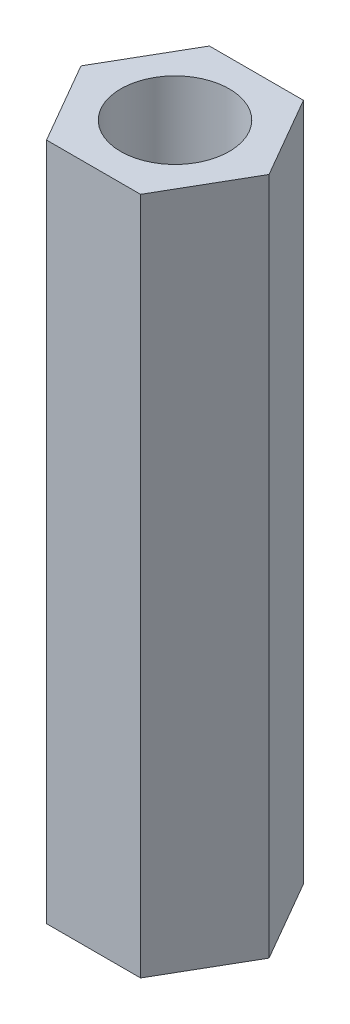
ISO-10303-21;
HEADER;
FILE_DESCRIPTION(('STEP AP214'),'2;1');
FILE_NAME('part.step','',(''),(''),'','','');
FILE_SCHEMA(('AUTOMOTIVE_DESIGN { 1 0 10303 214 1 1 1 1 }'));
ENDSEC;
DATA;
#1=APPLICATION_CONTEXT('core data for automotive mechanical design processes');
#2=APPLICATION_PROTOCOL_DEFINITION('international standard','automotive_design',2000,#1);
#3=PRODUCT_CONTEXT('',#1,'mechanical');
#4=PRODUCT('Part','Part','',(#3));
#5=PRODUCT_RELATED_PRODUCT_CATEGORY('part','',(#4));
#6=PRODUCT_DEFINITION_FORMATION('','',#4);
#7=PRODUCT_DEFINITION_CONTEXT('part definition',#1,'design');
#8=PRODUCT_DEFINITION('design','',#6,#7);
#9=PRODUCT_DEFINITION_SHAPE('','',#8);
#10=(LENGTH_UNIT() NAMED_UNIT(*) SI_UNIT(.MILLI.,.METRE.));
#11=(NAMED_UNIT(*) PLANE_ANGLE_UNIT() SI_UNIT($,.RADIAN.));
#12=(NAMED_UNIT(*) SI_UNIT($,.STERADIAN.) SOLID_ANGLE_UNIT());
#13=UNCERTAINTY_MEASURE_WITH_UNIT(LENGTH_MEASURE(1.E-05),#10,'distance_accuracy_value','');
#14=(GEOMETRIC_REPRESENTATION_CONTEXT(3) GLOBAL_UNCERTAINTY_ASSIGNED_CONTEXT((#13)) GLOBAL_UNIT_ASSIGNED_CONTEXT((#10,
#11,#12)) REPRESENTATION_CONTEXT('',''));
#15=CARTESIAN_POINT('',(0.,0.,0.));
#16=DIRECTION('',(0.,0.,1.));
#17=DIRECTION('',(1.,0.,0.));
#18=AXIS2_PLACEMENT_3D('',#15,#16,#17);
#19=CARTESIAN_POINT('',(0.,25.,0.));
#20=DIRECTION('',(0.,1.,0.));
#21=DIRECTION('',(0.,0.,1.));
#22=AXIS2_PLACEMENT_3D('',#19,#20,#21);
#23=PLANE('',#22);
#24=DIRECTION('',(-0.5,0.,0.866025403784439));
#25=VECTOR('',#24,1.);
#26=CARTESIAN_POINT('',(-1.73205080756888,25.,-3.));
#27=LINE('',#26,#25);
#28=CARTESIAN_POINT('',(-1.73205080756888,25.,-3.));
#29=VERTEX_POINT('',#28);
#30=CARTESIAN_POINT('',(-3.46410161513775,25.,0.));
#31=VERTEX_POINT('',#30);
#32=EDGE_CURVE('E150',#29,#31,#27,.T.);
#33=ORIENTED_EDGE('',*,*,#32,.T.);
#34=DIRECTION('',(0.499999999999999,0.,0.866025403784439));
#35=VECTOR('',#34,1.);
#36=CARTESIAN_POINT('',(-3.46410161513775,25.,0.));
#37=LINE('',#36,#35);
#38=CARTESIAN_POINT('',(-1.73205080756888,25.,3.));
#39=VERTEX_POINT('',#38);
#40=EDGE_CURVE('E98',#31,#39,#37,.T.);
#41=ORIENTED_EDGE('',*,*,#40,.T.);
#42=DIRECTION('',(1.,0.,0.));
#43=VECTOR('',#42,1.);
#44=CARTESIAN_POINT('',(-1.73205080756888,25.,3.));
#45=LINE('',#44,#43);
#46=CARTESIAN_POINT('',(1.73205080756888,25.,3.));
#47=VERTEX_POINT('',#46);
#48=EDGE_CURVE('E111',#39,#47,#45,.T.);
#49=ORIENTED_EDGE('',*,*,#48,.T.);
#50=DIRECTION('',(0.5,0.,-0.866025403784439));
#51=VECTOR('',#50,1.);
#52=CARTESIAN_POINT('',(1.73205080756888,25.,3.));
#53=LINE('',#52,#51);
#54=CARTESIAN_POINT('',(3.46410161513775,25.,0.));
#55=VERTEX_POINT('',#54);
#56=EDGE_CURVE('E105',#47,#55,#53,.T.);
#57=ORIENTED_EDGE('',*,*,#56,.T.);
#58=DIRECTION('',(-0.5,0.,-0.866025403784439));
#59=VECTOR('',#58,1.);
#60=CARTESIAN_POINT('',(3.46410161513775,25.,0.));
#61=LINE('',#60,#59);
#62=CARTESIAN_POINT('',(1.73205080756888,25.,-3.));
#63=VERTEX_POINT('',#62);
#64=EDGE_CURVE('E109',#55,#63,#61,.T.);
#65=ORIENTED_EDGE('',*,*,#64,.T.);
#66=DIRECTION('',(-1.,0.,0.));
#67=VECTOR('',#66,1.);
#68=CARTESIAN_POINT('',(1.73205080756888,25.,-3.));
#69=LINE('',#68,#67);
#70=EDGE_CURVE('E61',#63,#29,#69,.T.);
#71=ORIENTED_EDGE('',*,*,#70,.T.);
#72=EDGE_LOOP('',(#33,#41,#49,#57,#65,#71));
#73=FACE_BOUND('',#72,.T.);
#74=CARTESIAN_POINT('',(0.,25.,0.));
#75=DIRECTION('',(0.,1.,0.));
#76=DIRECTION('',(0.,0.,1.));
#77=AXIS2_PLACEMENT_3D('',#74,#75,#76);
#78=CIRCLE('',#77,2.);
#79=CARTESIAN_POINT('',(0.,25.,2.));
#80=VERTEX_POINT('',#79);
#81=EDGE_CURVE('E138',#80,#80,#78,.T.);
#82=ORIENTED_EDGE('',*,*,#81,.F.);
#83=EDGE_LOOP('',(#82));
#84=FACE_BOUND('',#83,.T.);
#85=ADVANCED_FACE('F43',(#73,#84),#23,.T.);
#86=CARTESIAN_POINT('',(0.,0.,0.));
#87=DIRECTION('',(0.,1.,0.));
#88=DIRECTION('',(0.,0.,1.));
#89=AXIS2_PLACEMENT_3D('',#86,#87,#88);
#90=PLANE('',#89);
#91=DIRECTION('',(-0.5,0.,0.866025403784439));
#92=VECTOR('',#91,1.);
#93=CARTESIAN_POINT('',(-1.73205080756888,0.,-3.));
#94=LINE('',#93,#92);
#95=CARTESIAN_POINT('',(-1.73205080756888,0.,-3.));
#96=VERTEX_POINT('',#95);
#97=CARTESIAN_POINT('',(-3.46410161513775,0.,0.));
#98=VERTEX_POINT('',#97);
#99=EDGE_CURVE('E133',#96,#98,#94,.T.);
#100=ORIENTED_EDGE('',*,*,#99,.F.);
#101=DIRECTION('',(-1.,0.,0.));
#102=VECTOR('',#101,1.);
#103=CARTESIAN_POINT('',(1.73205080756888,0.,-3.));
#104=LINE('',#103,#102);
#105=CARTESIAN_POINT('',(1.73205080756888,0.,-3.));
#106=VERTEX_POINT('',#105);
#107=EDGE_CURVE('E90',#106,#96,#104,.T.);
#108=ORIENTED_EDGE('',*,*,#107,.F.);
#109=DIRECTION('',(-0.5,0.,-0.866025403784439));
#110=VECTOR('',#109,1.);
#111=CARTESIAN_POINT('',(3.46410161513775,0.,0.));
#112=LINE('',#111,#110);
#113=CARTESIAN_POINT('',(3.46410161513775,0.,0.));
#114=VERTEX_POINT('',#113);
#115=EDGE_CURVE('E84',#114,#106,#112,.T.);
#116=ORIENTED_EDGE('',*,*,#115,.F.);
#117=DIRECTION('',(0.5,0.,-0.866025403784439));
#118=VECTOR('',#117,1.);
#119=CARTESIAN_POINT('',(1.73205080756888,0.,3.));
#120=LINE('',#119,#118);
#121=CARTESIAN_POINT('',(1.73205080756888,0.,3.));
#122=VERTEX_POINT('',#121);
#123=EDGE_CURVE('E120',#122,#114,#120,.T.);
#124=ORIENTED_EDGE('',*,*,#123,.F.);
#125=DIRECTION('',(1.,0.,0.));
#126=VECTOR('',#125,1.);
#127=CARTESIAN_POINT('',(-1.73205080756888,0.,3.));
#128=LINE('',#127,#126);
#129=CARTESIAN_POINT('',(-1.73205080756888,0.,3.));
#130=VERTEX_POINT('',#129);
#131=EDGE_CURVE('E141',#130,#122,#128,.T.);
#132=ORIENTED_EDGE('',*,*,#131,.F.);
#133=DIRECTION('',(0.499999999999999,0.,0.866025403784439));
#134=VECTOR('',#133,1.);
#135=CARTESIAN_POINT('',(-3.46410161513775,0.,0.));
#136=LINE('',#135,#134);
#137=EDGE_CURVE('E137',#98,#130,#136,.T.);
#138=ORIENTED_EDGE('',*,*,#137,.F.);
#139=EDGE_LOOP('',(#100,#108,#116,#124,#132,#138));
#140=FACE_BOUND('',#139,.T.);
#141=CARTESIAN_POINT('',(0.,0.,0.));
#142=DIRECTION('',(0.,1.,0.));
#143=DIRECTION('',(0.,0.,1.));
#144=AXIS2_PLACEMENT_3D('',#141,#142,#143);
#145=CIRCLE('',#144,2.);
#146=CARTESIAN_POINT('',(0.,0.,2.));
#147=VERTEX_POINT('',#146);
#148=EDGE_CURVE('E265',#147,#147,#145,.T.);
#149=ORIENTED_EDGE('',*,*,#148,.T.);
#150=EDGE_LOOP('',(#149));
#151=FACE_BOUND('',#150,.T.);
#152=ADVANCED_FACE('F163',(#140,#151),#90,.F.);
#153=CARTESIAN_POINT('',(-1.73205080756888,25.,-3.));
#154=DIRECTION('',(0.866025403784439,0.,0.5));
#155=DIRECTION('',(0.5,0.,-0.866025403784439));
#156=AXIS2_PLACEMENT_3D('',#153,#154,#155);
#157=PLANE('',#156);
#158=ORIENTED_EDGE('',*,*,#99,.T.);
#159=DIRECTION('',(0.,-1.,0.));
#160=VECTOR('',#159,1.);
#161=CARTESIAN_POINT('',(-3.46410161513775,25.,0.));
#162=LINE('',#161,#160);
#163=EDGE_CURVE('E11',#31,#98,#162,.T.);
#164=ORIENTED_EDGE('',*,*,#163,.F.);
#165=ORIENTED_EDGE('',*,*,#32,.F.);
#166=DIRECTION('',(0.,-1.,0.));
#167=VECTOR('',#166,1.);
#168=CARTESIAN_POINT('',(-1.73205080756888,25.,-3.));
#169=LINE('',#168,#167);
#170=EDGE_CURVE('E129',#29,#96,#169,.T.);
#171=ORIENTED_EDGE('',*,*,#170,.T.);
#172=EDGE_LOOP('',(#158,#164,#165,#171));
#173=FACE_BOUND('',#172,.T.);
#174=ADVANCED_FACE('F45',(#173),#157,.F.);
#175=CARTESIAN_POINT('',(-3.46410161513775,25.,0.));
#176=DIRECTION('',(0.866025403784439,0.,-0.499999999999999));
#177=DIRECTION('',(-0.499999999999999,0.,-0.866025403784439));
#178=AXIS2_PLACEMENT_3D('',#175,#176,#177);
#179=PLANE('',#178);
#180=ORIENTED_EDGE('',*,*,#137,.T.);
#181=DIRECTION('',(0.,-1.,0.));
#182=VECTOR('',#181,1.);
#183=CARTESIAN_POINT('',(-1.73205080756888,25.,3.));
#184=LINE('',#183,#182);
#185=EDGE_CURVE('E53',#39,#130,#184,.T.);
#186=ORIENTED_EDGE('',*,*,#185,.F.);
#187=ORIENTED_EDGE('',*,*,#40,.F.);
#188=ORIENTED_EDGE('',*,*,#163,.T.);
#189=EDGE_LOOP('',(#180,#186,#187,#188));
#190=FACE_BOUND('',#189,.T.);
#191=ADVANCED_FACE('F188',(#190),#179,.F.);
#192=CARTESIAN_POINT('',(-1.73205080756888,25.,3.));
#193=DIRECTION('',(0.,0.,-1.));
#194=DIRECTION('',(-1.,0.,0.));
#195=AXIS2_PLACEMENT_3D('',#192,#193,#194);
#196=PLANE('',#195);
#197=ORIENTED_EDGE('',*,*,#131,.T.);
#198=DIRECTION('',(0.,-1.,0.));
#199=VECTOR('',#198,1.);
#200=CARTESIAN_POINT('',(1.73205080756888,25.,3.));
#201=LINE('',#200,#199);
#202=EDGE_CURVE('E122',#47,#122,#201,.T.);
#203=ORIENTED_EDGE('',*,*,#202,.F.);
#204=ORIENTED_EDGE('',*,*,#48,.F.);
#205=ORIENTED_EDGE('',*,*,#185,.T.);
#206=EDGE_LOOP('',(#197,#203,#204,#205));
#207=FACE_BOUND('',#206,.T.);
#208=ADVANCED_FACE('F160',(#207),#196,.F.);
#209=CARTESIAN_POINT('',(1.73205080756888,25.,3.));
#210=DIRECTION('',(-0.866025403784439,0.,-0.5));
#211=DIRECTION('',(-0.5,0.,0.866025403784439));
#212=AXIS2_PLACEMENT_3D('',#209,#210,#211);
#213=PLANE('',#212);
#214=ORIENTED_EDGE('',*,*,#123,.T.);
#215=DIRECTION('',(0.,-1.,0.));
#216=VECTOR('',#215,1.);
#217=CARTESIAN_POINT('',(3.46410161513775,25.,0.));
#218=LINE('',#217,#216);
#219=EDGE_CURVE('E117',#55,#114,#218,.T.);
#220=ORIENTED_EDGE('',*,*,#219,.F.);
#221=ORIENTED_EDGE('',*,*,#56,.F.);
#222=ORIENTED_EDGE('',*,*,#202,.T.);
#223=EDGE_LOOP('',(#214,#220,#221,#222));
#224=FACE_BOUND('',#223,.T.);
#225=ADVANCED_FACE('F118',(#224),#213,.F.);
#226=CARTESIAN_POINT('',(3.46410161513775,25.,0.));
#227=DIRECTION('',(-0.866025403784439,0.,0.5));
#228=DIRECTION('',(0.5,0.,0.866025403784439));
#229=AXIS2_PLACEMENT_3D('',#226,#227,#228);
#230=PLANE('',#229);
#231=ORIENTED_EDGE('',*,*,#115,.T.);
#232=DIRECTION('',(0.,-1.,0.));
#233=VECTOR('',#232,1.);
#234=CARTESIAN_POINT('',(1.73205080756888,25.,-3.));
#235=LINE('',#234,#233);
#236=EDGE_CURVE('E123',#63,#106,#235,.T.);
#237=ORIENTED_EDGE('',*,*,#236,.F.);
#238=ORIENTED_EDGE('',*,*,#64,.F.);
#239=ORIENTED_EDGE('',*,*,#219,.T.);
#240=EDGE_LOOP('',(#231,#237,#238,#239));
#241=FACE_BOUND('',#240,.T.);
#242=ADVANCED_FACE('F125',(#241),#230,.F.);
#243=CARTESIAN_POINT('',(1.73205080756888,25.,-3.));
#244=DIRECTION('',(0.,0.,1.));
#245=DIRECTION('',(1.,0.,0.));
#246=AXIS2_PLACEMENT_3D('',#243,#244,#245);
#247=PLANE('',#246);
#248=ORIENTED_EDGE('',*,*,#107,.T.);
#249=ORIENTED_EDGE('',*,*,#170,.F.);
#250=ORIENTED_EDGE('',*,*,#70,.F.);
#251=ORIENTED_EDGE('',*,*,#236,.T.);
#252=EDGE_LOOP('',(#248,#249,#250,#251));
#253=FACE_BOUND('',#252,.T.);
#254=ADVANCED_FACE('F168',(#253),#247,.F.);
#255=CARTESIAN_POINT('',(0.,25.,0.));
#256=DIRECTION('',(0.,-1.,0.));
#257=DIRECTION('',(0.,0.,-1.));
#258=AXIS2_PLACEMENT_3D('',#255,#256,#257);
#259=CYLINDRICAL_SURFACE('',#258,2.);
#260=ORIENTED_EDGE('',*,*,#81,.T.);
#261=EDGE_LOOP('',(#260));
#262=FACE_BOUND('',#261,.T.);
#263=ORIENTED_EDGE('',*,*,#148,.F.);
#264=EDGE_LOOP('',(#263));
#265=FACE_BOUND('',#264,.T.);
#266=ADVANCED_FACE('F170',(#262,#265),#259,.F.);
#267=CLOSED_SHELL('',(#85,#152,#174,#191,#208,#225,#242,#254,#266));
#268=MANIFOLD_SOLID_BREP('B2',#267);
#269=ADVANCED_BREP_SHAPE_REPRESENTATION('',(#18,#268),#14);
#270=SHAPE_DEFINITION_REPRESENTATION(#9,#269);
ENDSEC;
END-ISO-10303-21;
